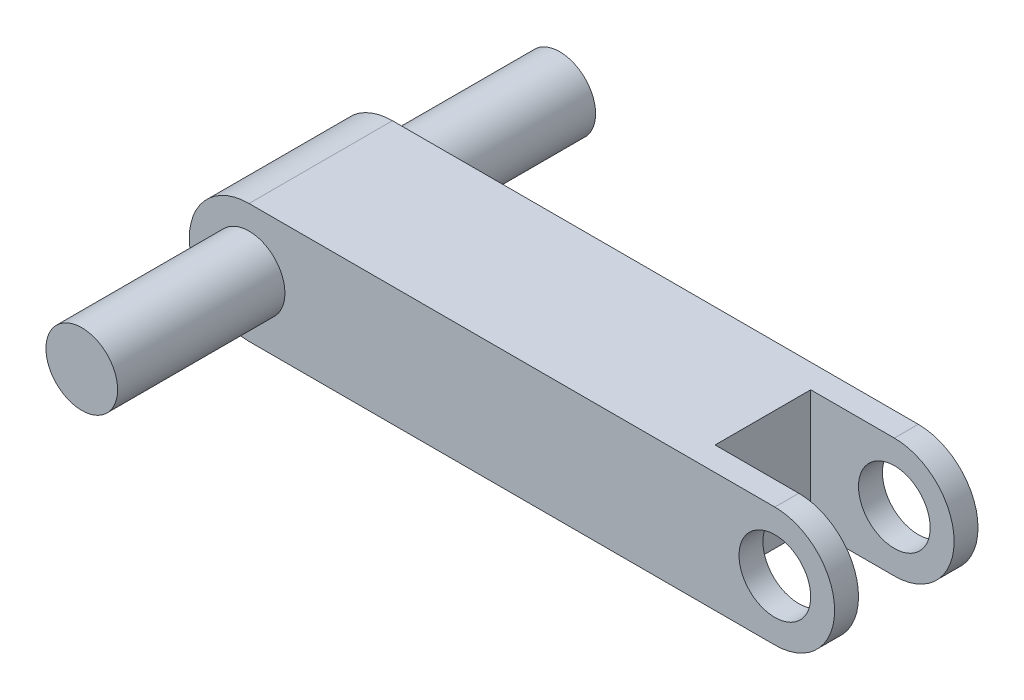
ISO-10303-21;
HEADER;
FILE_DESCRIPTION(('STEP AP214'),'2;1');
FILE_NAME('part.step','',(''),(''),'','','');
FILE_SCHEMA(('AUTOMOTIVE_DESIGN { 1 0 10303 214 1 1 1 1 }'));
ENDSEC;
DATA;
#1=APPLICATION_CONTEXT('core data for automotive mechanical design processes');
#2=APPLICATION_PROTOCOL_DEFINITION('international standard','automotive_design',2000,#1);
#3=PRODUCT_CONTEXT('',#1,'mechanical');
#4=PRODUCT('Part','Part','',(#3));
#5=PRODUCT_RELATED_PRODUCT_CATEGORY('part','',(#4));
#6=PRODUCT_DEFINITION_FORMATION('','',#4);
#7=PRODUCT_DEFINITION_CONTEXT('part definition',#1,'design');
#8=PRODUCT_DEFINITION('design','',#6,#7);
#9=PRODUCT_DEFINITION_SHAPE('','',#8);
#10=(LENGTH_UNIT() NAMED_UNIT(*) SI_UNIT(.MILLI.,.METRE.));
#11=(NAMED_UNIT(*) PLANE_ANGLE_UNIT() SI_UNIT($,.RADIAN.));
#12=(NAMED_UNIT(*) SI_UNIT($,.STERADIAN.) SOLID_ANGLE_UNIT());
#13=UNCERTAINTY_MEASURE_WITH_UNIT(LENGTH_MEASURE(1.E-05),#10,'distance_accuracy_value','');
#14=(GEOMETRIC_REPRESENTATION_CONTEXT(3) GLOBAL_UNCERTAINTY_ASSIGNED_CONTEXT((#13)) GLOBAL_UNIT_ASSIGNED_CONTEXT((#10,
#11,#12)) REPRESENTATION_CONTEXT('',''));
#15=CARTESIAN_POINT('',(0.,0.,0.));
#16=DIRECTION('',(0.,0.,1.));
#17=DIRECTION('',(1.,0.,0.));
#18=AXIS2_PLACEMENT_3D('',#15,#16,#17);
#19=CARTESIAN_POINT('',(128.656806375104,-0.373109340248999,60.));
#20=DIRECTION('',(0.,0.,-1.));
#21=DIRECTION('',(-1.,0.,0.));
#22=AXIS2_PLACEMENT_3D('',#19,#20,#21);
#23=CYLINDRICAL_SURFACE('',#22,25.);
#24=DIRECTION('',(0.,0.,-1.));
#25=VECTOR('',#24,1.);
#26=CARTESIAN_POINT('',(128.656806375104,24.626890659751,60.));
#27=LINE('',#26,#25);
#28=CARTESIAN_POINT('',(128.656806375104,24.626890659751,9.99999999999999));
#29=VERTEX_POINT('',#28);
#30=CARTESIAN_POINT('',(128.656806375104,24.626890659751,0.));
#31=VERTEX_POINT('',#30);
#32=EDGE_CURVE('E168',#29,#31,#27,.T.);
#33=ORIENTED_EDGE('',*,*,#32,.F.);
#34=CARTESIAN_POINT('',(128.656806375104,-0.373109340248999,9.99999999999999));
#35=DIRECTION('',(0.,0.,-1.));
#36=DIRECTION('',(-1.,0.,0.));
#37=AXIS2_PLACEMENT_3D('',#34,#35,#36);
#38=CIRCLE('',#37,25.);
#39=CARTESIAN_POINT('',(128.656806375104,-25.373109340249,9.99999999999999));
#40=VERTEX_POINT('',#39);
#41=EDGE_CURVE('E117',#29,#40,#38,.T.);
#42=ORIENTED_EDGE('',*,*,#41,.T.);
#43=DIRECTION('',(0.,0.,-1.));
#44=VECTOR('',#43,1.);
#45=CARTESIAN_POINT('',(128.656806375104,-25.373109340249,60.));
#46=LINE('',#45,#44);
#47=CARTESIAN_POINT('',(128.656806375104,-25.373109340249,0.));
#48=VERTEX_POINT('',#47);
#49=EDGE_CURVE('E171',#40,#48,#46,.T.);
#50=ORIENTED_EDGE('',*,*,#49,.T.);
#51=CARTESIAN_POINT('',(128.656806375104,-0.373109340248999,0.));
#52=DIRECTION('',(0.,0.,1.));
#53=DIRECTION('',(1.,0.,0.));
#54=AXIS2_PLACEMENT_3D('',#51,#52,#53);
#55=CIRCLE('',#54,25.);
#56=EDGE_CURVE('E163',#48,#31,#55,.T.);
#57=ORIENTED_EDGE('',*,*,#56,.T.);
#58=EDGE_LOOP('',(#33,#42,#50,#57));
#59=FACE_BOUND('',#58,.T.);
#60=ADVANCED_FACE('F31',(#59),#23,.T.);
#61=CARTESIAN_POINT('',(-91.3431936248964,-0.373109340248999,0.));
#62=DIRECTION('',(0.,0.,1.));
#63=DIRECTION('',(1.,0.,0.));
#64=AXIS2_PLACEMENT_3D('',#61,#62,#63);
#65=PLANE('',#64);
#66=CARTESIAN_POINT('',(128.656806375104,-0.373109340248999,0.));
#67=DIRECTION('',(0.,0.,1.));
#68=DIRECTION('',(1.,0.,0.));
#69=AXIS2_PLACEMENT_3D('',#66,#67,#68);
#70=CIRCLE('',#69,15.);
#71=CARTESIAN_POINT('',(143.656806375104,-0.373109340248999,0.));
#72=VERTEX_POINT('',#71);
#73=EDGE_CURVE('E124',#72,#72,#70,.T.);
#74=ORIENTED_EDGE('',*,*,#73,.T.);
#75=EDGE_LOOP('',(#74));
#76=FACE_BOUND('',#75,.T.);
#77=CARTESIAN_POINT('',(-91.3431936248964,-0.373109340248999,0.));
#78=DIRECTION('',(0.,0.,1.));
#79=DIRECTION('',(1.,0.,0.));
#80=AXIS2_PLACEMENT_3D('',#77,#78,#79);
#81=CIRCLE('',#80,25.);
#82=CARTESIAN_POINT('',(-91.3431936248964,24.626890659751,0.));
#83=VERTEX_POINT('',#82);
#84=CARTESIAN_POINT('',(-91.3431936248964,-25.373109340249,0.));
#85=VERTEX_POINT('',#84);
#86=EDGE_CURVE('E148',#83,#85,#81,.T.);
#87=ORIENTED_EDGE('',*,*,#86,.F.);
#88=DIRECTION('',(-1.,0.,0.));
#89=VECTOR('',#88,1.);
#90=CARTESIAN_POINT('',(-91.3431936248964,24.626890659751,0.));
#91=LINE('',#90,#89);
#92=EDGE_CURVE('E76',#31,#83,#91,.T.);
#93=ORIENTED_EDGE('',*,*,#92,.F.);
#94=ORIENTED_EDGE('',*,*,#56,.F.);
#95=DIRECTION('',(1.,0.,0.));
#96=VECTOR('',#95,1.);
#97=CARTESIAN_POINT('',(-91.3431936248964,-25.373109340249,0.));
#98=LINE('',#97,#96);
#99=EDGE_CURVE('E160',#85,#48,#98,.T.);
#100=ORIENTED_EDGE('',*,*,#99,.F.);
#101=EDGE_LOOP('',(#87,#93,#94,#100));
#102=FACE_BOUND('',#101,.T.);
#103=CARTESIAN_POINT('',(-91.3431936248964,-0.373109340248999,0.));
#104=DIRECTION('',(0.,0.,1.));
#105=DIRECTION('',(1.,0.,0.));
#106=AXIS2_PLACEMENT_3D('',#103,#104,#105);
#107=CIRCLE('',#106,15.);
#108=CARTESIAN_POINT('',(-76.3431936248964,-0.373109340248999,0.));
#109=VERTEX_POINT('',#108);
#110=EDGE_CURVE('E40',#109,#109,#107,.F.);
#111=ORIENTED_EDGE('',*,*,#110,.F.);
#112=EDGE_LOOP('',(#111));
#113=FACE_BOUND('',#112,.T.);
#114=ADVANCED_FACE('F182',(#76,#102,#113),#65,.F.);
#115=CARTESIAN_POINT('',(-91.3431936248964,-0.373109340248999,60.));
#116=DIRECTION('',(0.,0.,1.));
#117=DIRECTION('',(1.,0.,0.));
#118=AXIS2_PLACEMENT_3D('',#115,#116,#117);
#119=PLANE('',#118);
#120=CARTESIAN_POINT('',(128.656806375104,-0.373109340248999,60.));
#121=DIRECTION('',(0.,0.,1.));
#122=DIRECTION('',(1.,0.,0.));
#123=AXIS2_PLACEMENT_3D('',#120,#121,#122);
#124=CIRCLE('',#123,15.);
#125=CARTESIAN_POINT('',(143.656806375104,-0.373109340248999,60.));
#126=VERTEX_POINT('',#125);
#127=EDGE_CURVE('E306',#126,#126,#124,.T.);
#128=ORIENTED_EDGE('',*,*,#127,.F.);
#129=EDGE_LOOP('',(#128));
#130=FACE_BOUND('',#129,.T.);
#131=CARTESIAN_POINT('',(-91.3431936248964,-0.373109340248999,60.));
#132=DIRECTION('',(0.,0.,1.));
#133=DIRECTION('',(1.,0.,0.));
#134=AXIS2_PLACEMENT_3D('',#131,#132,#133);
#135=CIRCLE('',#134,25.);
#136=CARTESIAN_POINT('',(-91.3431936248964,24.626890659751,60.));
#137=VERTEX_POINT('',#136);
#138=CARTESIAN_POINT('',(-91.3431936248964,-25.373109340249,60.));
#139=VERTEX_POINT('',#138);
#140=EDGE_CURVE('E151',#137,#139,#135,.T.);
#141=ORIENTED_EDGE('',*,*,#140,.T.);
#142=DIRECTION('',(1.,0.,0.));
#143=VECTOR('',#142,1.);
#144=CARTESIAN_POINT('',(-91.3431936248964,-25.373109340249,60.));
#145=LINE('',#144,#143);
#146=CARTESIAN_POINT('',(128.656806375104,-25.373109340249,60.));
#147=VERTEX_POINT('',#146);
#148=EDGE_CURVE('E84',#139,#147,#145,.T.);
#149=ORIENTED_EDGE('',*,*,#148,.T.);
#150=CARTESIAN_POINT('',(128.656806375104,-0.373109340248999,60.));
#151=DIRECTION('',(0.,0.,1.));
#152=DIRECTION('',(1.,0.,0.));
#153=AXIS2_PLACEMENT_3D('',#150,#151,#152);
#154=CIRCLE('',#153,25.);
#155=CARTESIAN_POINT('',(128.656806375104,24.626890659751,60.));
#156=VERTEX_POINT('',#155);
#157=EDGE_CURVE('E154',#147,#156,#154,.T.);
#158=ORIENTED_EDGE('',*,*,#157,.T.);
#159=DIRECTION('',(-1.,0.,0.));
#160=VECTOR('',#159,1.);
#161=CARTESIAN_POINT('',(-91.3431936248964,24.626890659751,60.));
#162=LINE('',#161,#160);
#163=EDGE_CURVE('E56',#156,#137,#162,.T.);
#164=ORIENTED_EDGE('',*,*,#163,.T.);
#165=EDGE_LOOP('',(#141,#149,#158,#164));
#166=FACE_BOUND('',#165,.T.);
#167=CARTESIAN_POINT('',(-91.3431936248964,-0.373109340248999,60.));
#168=DIRECTION('',(0.,0.,1.));
#169=DIRECTION('',(1.,0.,0.));
#170=AXIS2_PLACEMENT_3D('',#167,#168,#169);
#171=CIRCLE('',#170,15.);
#172=CARTESIAN_POINT('',(-76.3431936248964,-0.373109340248999,60.));
#173=VERTEX_POINT('',#172);
#174=EDGE_CURVE('E144',#173,#173,#171,.T.);
#175=ORIENTED_EDGE('',*,*,#174,.F.);
#176=EDGE_LOOP('',(#175));
#177=FACE_BOUND('',#176,.T.);
#178=ADVANCED_FACE('F184',(#130,#166,#177),#119,.T.);
#179=CARTESIAN_POINT('',(-91.3431936248964,-0.373109340248999,60.));
#180=DIRECTION('',(0.,0.,-1.));
#181=DIRECTION('',(-1.,0.,0.));
#182=AXIS2_PLACEMENT_3D('',#179,#180,#181);
#183=CYLINDRICAL_SURFACE('',#182,25.);
#184=ORIENTED_EDGE('',*,*,#86,.T.);
#185=DIRECTION('',(0.,0.,-1.));
#186=VECTOR('',#185,1.);
#187=CARTESIAN_POINT('',(-91.3431936248964,-25.373109340249,60.));
#188=LINE('',#187,#186);
#189=EDGE_CURVE('E175',#139,#85,#188,.T.);
#190=ORIENTED_EDGE('',*,*,#189,.F.);
#191=ORIENTED_EDGE('',*,*,#140,.F.);
#192=DIRECTION('',(0.,0.,-1.));
#193=VECTOR('',#192,1.);
#194=CARTESIAN_POINT('',(-91.3431936248964,24.626890659751,60.));
#195=LINE('',#194,#193);
#196=EDGE_CURVE('E157',#137,#83,#195,.T.);
#197=ORIENTED_EDGE('',*,*,#196,.T.);
#198=EDGE_LOOP('',(#184,#190,#191,#197));
#199=FACE_BOUND('',#198,.T.);
#200=ADVANCED_FACE('F33',(#199),#183,.T.);
#201=CARTESIAN_POINT('',(-91.3431936248964,-25.373109340249,60.));
#202=DIRECTION('',(0.,1.,0.));
#203=DIRECTION('',(0.,0.,1.));
#204=AXIS2_PLACEMENT_3D('',#201,#202,#203);
#205=PLANE('',#204);
#206=ORIENTED_EDGE('',*,*,#49,.F.);
#207=DIRECTION('',(-1.,0.,0.));
#208=VECTOR('',#207,1.);
#209=CARTESIAN_POINT('',(-91.3431936248964,-25.373109340249,10.));
#210=LINE('',#209,#208);
#211=CARTESIAN_POINT('',(93.6568063751036,-25.373109340249,9.99999999999999));
#212=VERTEX_POINT('',#211);
#213=EDGE_CURVE('E138',#40,#212,#210,.T.);
#214=ORIENTED_EDGE('',*,*,#213,.T.);
#215=DIRECTION('',(0.,0.,1.));
#216=VECTOR('',#215,1.);
#217=CARTESIAN_POINT('',(93.6568063751036,-25.373109340249,59.9999999999999));
#218=LINE('',#217,#216);
#219=CARTESIAN_POINT('',(93.6568063751036,-25.373109340249,50.));
#220=VERTEX_POINT('',#219);
#221=EDGE_CURVE('E109',#212,#220,#218,.T.);
#222=ORIENTED_EDGE('',*,*,#221,.T.);
#223=DIRECTION('',(1.,0.,0.));
#224=VECTOR('',#223,1.);
#225=CARTESIAN_POINT('',(-91.3431936248964,-25.373109340249,50.));
#226=LINE('',#225,#224);
#227=CARTESIAN_POINT('',(128.656806375104,-25.373109340249,50.));
#228=VERTEX_POINT('',#227);
#229=EDGE_CURVE('E134',#220,#228,#226,.T.);
#230=ORIENTED_EDGE('',*,*,#229,.T.);
#231=EDGE_CURVE('E172',#147,#228,#46,.T.);
#232=ORIENTED_EDGE('',*,*,#231,.F.);
#233=ORIENTED_EDGE('',*,*,#148,.F.);
#234=ORIENTED_EDGE('',*,*,#189,.T.);
#235=ORIENTED_EDGE('',*,*,#99,.T.);
#236=EDGE_LOOP('',(#206,#214,#222,#230,#232,#233,#234,#235));
#237=FACE_BOUND('',#236,.T.);
#238=ADVANCED_FACE('F202',(#237),#205,.F.);
#239=CARTESIAN_POINT('',(128.656806375104,-0.373109340248999,50.));
#240=DIRECTION('',(0.,0.,1.));
#241=DIRECTION('',(1.,0.,0.));
#242=AXIS2_PLACEMENT_3D('',#239,#240,#241);
#243=CIRCLE('',#242,25.);
#244=CARTESIAN_POINT('',(128.656806375104,24.626890659751,50.));
#245=VERTEX_POINT('',#244);
#246=EDGE_CURVE('E112',#228,#245,#243,.T.);
#247=ORIENTED_EDGE('',*,*,#246,.T.);
#248=EDGE_CURVE('E169',#156,#245,#27,.T.);
#249=ORIENTED_EDGE('',*,*,#248,.F.);
#250=ORIENTED_EDGE('',*,*,#157,.F.);
#251=ORIENTED_EDGE('',*,*,#231,.T.);
#252=EDGE_LOOP('',(#247,#249,#250,#251));
#253=FACE_BOUND('',#252,.T.);
#254=ADVANCED_FACE('F195',(#253),#23,.T.);
#255=CARTESIAN_POINT('',(-91.3431936248964,24.626890659751,60.));
#256=DIRECTION('',(0.,-1.,0.));
#257=DIRECTION('',(0.,0.,-1.));
#258=AXIS2_PLACEMENT_3D('',#255,#256,#257);
#259=PLANE('',#258);
#260=DIRECTION('',(0.,0.,1.));
#261=VECTOR('',#260,1.);
#262=CARTESIAN_POINT('',(93.6568063751036,24.626890659751,9.99999999999999));
#263=LINE('',#262,#261);
#264=CARTESIAN_POINT('',(93.6568063751036,24.626890659751,9.99999999999999));
#265=VERTEX_POINT('',#264);
#266=CARTESIAN_POINT('',(93.6568063751036,24.626890659751,50.));
#267=VERTEX_POINT('',#266);
#268=EDGE_CURVE('E47',#265,#267,#263,.T.);
#269=ORIENTED_EDGE('',*,*,#268,.F.);
#270=DIRECTION('',(1.,0.,0.));
#271=VECTOR('',#270,1.);
#272=CARTESIAN_POINT('',(-91.3431936248964,24.626890659751,10.));
#273=LINE('',#272,#271);
#274=EDGE_CURVE('E11',#265,#29,#273,.T.);
#275=ORIENTED_EDGE('',*,*,#274,.T.);
#276=ORIENTED_EDGE('',*,*,#32,.T.);
#277=ORIENTED_EDGE('',*,*,#92,.T.);
#278=ORIENTED_EDGE('',*,*,#196,.F.);
#279=ORIENTED_EDGE('',*,*,#163,.F.);
#280=ORIENTED_EDGE('',*,*,#248,.T.);
#281=DIRECTION('',(1.,0.,0.));
#282=VECTOR('',#281,1.);
#283=CARTESIAN_POINT('',(93.6568063751036,24.626890659751,50.));
#284=LINE('',#283,#282);
#285=EDGE_CURVE('E123',#267,#245,#284,.T.);
#286=ORIENTED_EDGE('',*,*,#285,.F.);
#287=EDGE_LOOP('',(#269,#275,#276,#277,#278,#279,#280,#286));
#288=FACE_BOUND('',#287,.T.);
#289=ADVANCED_FACE('F120',(#288),#259,.F.);
#290=CARTESIAN_POINT('',(-91.3431936248964,-0.373109340248999,130.));
#291=DIRECTION('',(0.,0.,-1.));
#292=DIRECTION('',(-1.,0.,0.));
#293=AXIS2_PLACEMENT_3D('',#290,#291,#292);
#294=CYLINDRICAL_SURFACE('',#293,15.);
#295=CARTESIAN_POINT('',(-91.3431936248964,-0.373109340248999,130.));
#296=DIRECTION('',(0.,0.,1.));
#297=DIRECTION('',(1.,0.,0.));
#298=AXIS2_PLACEMENT_3D('',#295,#296,#297);
#299=CIRCLE('',#298,15.);
#300=CARTESIAN_POINT('',(-76.3431936248964,-0.373109340248999,130.));
#301=VERTEX_POINT('',#300);
#302=EDGE_CURVE('E145',#301,#301,#299,.T.);
#303=ORIENTED_EDGE('',*,*,#302,.F.);
#304=EDGE_LOOP('',(#303));
#305=FACE_BOUND('',#304,.T.);
#306=ORIENTED_EDGE('',*,*,#174,.T.);
#307=EDGE_LOOP('',(#306));
#308=FACE_BOUND('',#307,.T.);
#309=ADVANCED_FACE('F200',(#305,#308),#294,.T.);
#310=CARTESIAN_POINT('',(-91.3431936248964,-0.373109340248999,130.));
#311=DIRECTION('',(0.,0.,1.));
#312=DIRECTION('',(1.,0.,0.));
#313=AXIS2_PLACEMENT_3D('',#310,#311,#312);
#314=PLANE('',#313);
#315=ORIENTED_EDGE('',*,*,#302,.T.);
#316=EDGE_LOOP('',(#315));
#317=FACE_BOUND('',#316,.T.);
#318=ADVANCED_FACE('F241',(#317),#314,.T.);
#319=CARTESIAN_POINT('',(-91.3431936248964,-0.373109340248999,-70.));
#320=DIRECTION('',(0.,0.,1.));
#321=DIRECTION('',(1.,0.,0.));
#322=AXIS2_PLACEMENT_3D('',#319,#320,#321);
#323=CYLINDRICAL_SURFACE('',#322,15.);
#324=CARTESIAN_POINT('',(-91.3431936248964,-0.373109340248999,-70.));
#325=DIRECTION('',(0.,0.,-1.));
#326=DIRECTION('',(-1.,0.,0.));
#327=AXIS2_PLACEMENT_3D('',#324,#325,#326);
#328=CIRCLE('',#327,15.);
#329=CARTESIAN_POINT('',(-106.343193624896,-0.373109340248999,-70.));
#330=VERTEX_POINT('',#329);
#331=EDGE_CURVE('E141',#330,#330,#328,.T.);
#332=ORIENTED_EDGE('',*,*,#331,.F.);
#333=EDGE_LOOP('',(#332));
#334=FACE_BOUND('',#333,.T.);
#335=ORIENTED_EDGE('',*,*,#110,.T.);
#336=EDGE_LOOP('',(#335));
#337=FACE_BOUND('',#336,.T.);
#338=ADVANCED_FACE('F180',(#334,#337),#323,.T.);
#339=CARTESIAN_POINT('',(-91.3431936248964,-0.373109340248999,-70.));
#340=DIRECTION('',(0.,0.,-1.));
#341=DIRECTION('',(-1.,0.,0.));
#342=AXIS2_PLACEMENT_3D('',#339,#340,#341);
#343=PLANE('',#342);
#344=ORIENTED_EDGE('',*,*,#331,.T.);
#345=EDGE_LOOP('',(#344));
#346=FACE_BOUND('',#345,.T.);
#347=ADVANCED_FACE('F235',(#346),#343,.T.);
#348=CARTESIAN_POINT('',(93.6568063751036,-50.373109340249,9.99999999999999));
#349=DIRECTION('',(-1.,0.,0.));
#350=DIRECTION('',(0.,0.,1.));
#351=AXIS2_PLACEMENT_3D('',#348,#349,#350);
#352=PLANE('',#351);
#353=DIRECTION('',(0.,1.,0.));
#354=VECTOR('',#353,1.);
#355=CARTESIAN_POINT('',(93.6568063751036,-50.373109340249,9.99999999999999));
#356=LINE('',#355,#354);
#357=EDGE_CURVE('E105',#212,#265,#356,.T.);
#358=ORIENTED_EDGE('',*,*,#357,.T.);
#359=ORIENTED_EDGE('',*,*,#268,.T.);
#360=DIRECTION('',(0.,1.,0.));
#361=VECTOR('',#360,1.);
#362=CARTESIAN_POINT('',(93.6568063751036,-50.373109340249,50.));
#363=LINE('',#362,#361);
#364=EDGE_CURVE('E113',#220,#267,#363,.T.);
#365=ORIENTED_EDGE('',*,*,#364,.F.);
#366=ORIENTED_EDGE('',*,*,#221,.F.);
#367=EDGE_LOOP('',(#358,#359,#365,#366));
#368=FACE_BOUND('',#367,.T.);
#369=ADVANCED_FACE('F107',(#368),#352,.F.);
#370=CARTESIAN_POINT('',(93.6568063751036,-50.373109340249,9.99999999999999));
#371=DIRECTION('',(0.,0.,-1.));
#372=DIRECTION('',(-1.,0.,0.));
#373=AXIS2_PLACEMENT_3D('',#370,#371,#372);
#374=PLANE('',#373);
#375=CARTESIAN_POINT('',(128.656806375104,-0.373109340248999,9.99999999999998));
#376=DIRECTION('',(0.,0.,-1.));
#377=DIRECTION('',(-1.,0.,0.));
#378=AXIS2_PLACEMENT_3D('',#375,#376,#377);
#379=CIRCLE('',#378,15.);
#380=CARTESIAN_POINT('',(113.656806375104,-0.373109340248999,9.99999999999998));
#381=VERTEX_POINT('',#380);
#382=EDGE_CURVE('E128',#381,#381,#379,.T.);
#383=ORIENTED_EDGE('',*,*,#382,.T.);
#384=EDGE_LOOP('',(#383));
#385=FACE_BOUND('',#384,.T.);
#386=ORIENTED_EDGE('',*,*,#41,.F.);
#387=ORIENTED_EDGE('',*,*,#274,.F.);
#388=ORIENTED_EDGE('',*,*,#357,.F.);
#389=ORIENTED_EDGE('',*,*,#213,.F.);
#390=EDGE_LOOP('',(#386,#387,#388,#389));
#391=FACE_BOUND('',#390,.T.);
#392=ADVANCED_FACE('F115',(#385,#391),#374,.F.);
#393=CARTESIAN_POINT('',(93.6568063751036,-50.373109340249,50.));
#394=DIRECTION('',(0.,0.,1.));
#395=DIRECTION('',(1.,0.,0.));
#396=AXIS2_PLACEMENT_3D('',#393,#394,#395);
#397=PLANE('',#396);
#398=CARTESIAN_POINT('',(128.656806375104,-0.373109340248999,50.));
#399=DIRECTION('',(0.,0.,1.));
#400=DIRECTION('',(1.,0.,0.));
#401=AXIS2_PLACEMENT_3D('',#398,#399,#400);
#402=CIRCLE('',#401,15.);
#403=CARTESIAN_POINT('',(143.656806375104,-0.373109340248999,50.));
#404=VERTEX_POINT('',#403);
#405=EDGE_CURVE('E35',#404,#404,#402,.T.);
#406=ORIENTED_EDGE('',*,*,#405,.T.);
#407=EDGE_LOOP('',(#406));
#408=FACE_BOUND('',#407,.T.);
#409=ORIENTED_EDGE('',*,*,#364,.T.);
#410=ORIENTED_EDGE('',*,*,#285,.T.);
#411=ORIENTED_EDGE('',*,*,#246,.F.);
#412=ORIENTED_EDGE('',*,*,#229,.F.);
#413=EDGE_LOOP('',(#409,#410,#411,#412));
#414=FACE_BOUND('',#413,.T.);
#415=ADVANCED_FACE('F217',(#408,#414),#397,.F.);
#416=CARTESIAN_POINT('',(128.656806375104,-0.373109340248999,-15.));
#417=DIRECTION('',(0.,0.,1.));
#418=DIRECTION('',(1.,0.,0.));
#419=AXIS2_PLACEMENT_3D('',#416,#417,#418);
#420=CYLINDRICAL_SURFACE('',#419,15.);
#421=ORIENTED_EDGE('',*,*,#127,.T.);
#422=EDGE_LOOP('',(#421));
#423=FACE_BOUND('',#422,.T.);
#424=ORIENTED_EDGE('',*,*,#405,.F.);
#425=EDGE_LOOP('',(#424));
#426=FACE_BOUND('',#425,.T.);
#427=ADVANCED_FACE('F219',(#423,#426),#420,.F.);
#428=ORIENTED_EDGE('',*,*,#382,.F.);
#429=EDGE_LOOP('',(#428));
#430=FACE_BOUND('',#429,.T.);
#431=ORIENTED_EDGE('',*,*,#73,.F.);
#432=EDGE_LOOP('',(#431));
#433=FACE_BOUND('',#432,.T.);
#434=ADVANCED_FACE('F226',(#430,#433),#420,.F.);
#435=CLOSED_SHELL('',(#60,#114,#178,#200,#238,#254,#289,#309,#318,#338,#347,#369,#392,#415,#427,#434));
#436=MANIFOLD_SOLID_BREP('B2',#435);
#437=ADVANCED_BREP_SHAPE_REPRESENTATION('',(#18,#436),#14);
#438=SHAPE_DEFINITION_REPRESENTATION(#9,#437);
ENDSEC;
END-ISO-10303-21;
